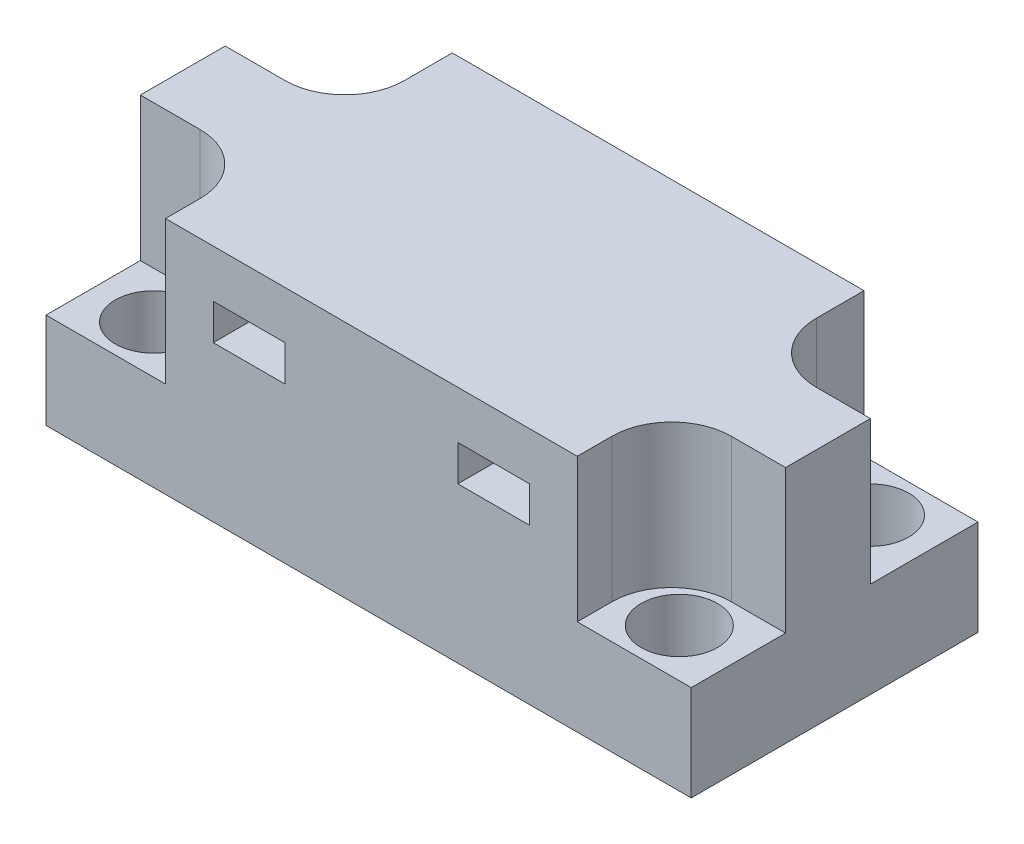
ISO-10303-21;
HEADER;
FILE_DESCRIPTION(('STEP AP214'),'2;1');
FILE_NAME('part.step','',(''),(''),'','','');
FILE_SCHEMA(('AUTOMOTIVE_DESIGN { 1 0 10303 214 1 1 1 1 }'));
ENDSEC;
DATA;
#1=APPLICATION_CONTEXT('core data for automotive mechanical design processes');
#2=APPLICATION_PROTOCOL_DEFINITION('international standard','automotive_design',2000,#1);
#3=PRODUCT_CONTEXT('',#1,'mechanical');
#4=PRODUCT('Part','Part','',(#3));
#5=PRODUCT_RELATED_PRODUCT_CATEGORY('part','',(#4));
#6=PRODUCT_DEFINITION_FORMATION('','',#4);
#7=PRODUCT_DEFINITION_CONTEXT('part definition',#1,'design');
#8=PRODUCT_DEFINITION('design','',#6,#7);
#9=PRODUCT_DEFINITION_SHAPE('','',#8);
#10=(LENGTH_UNIT() NAMED_UNIT(*) SI_UNIT(.MILLI.,.METRE.));
#11=(NAMED_UNIT(*) PLANE_ANGLE_UNIT() SI_UNIT($,.RADIAN.));
#12=(NAMED_UNIT(*) SI_UNIT($,.STERADIAN.) SOLID_ANGLE_UNIT());
#13=UNCERTAINTY_MEASURE_WITH_UNIT(LENGTH_MEASURE(1.E-05),#10,'distance_accuracy_value','');
#14=(GEOMETRIC_REPRESENTATION_CONTEXT(3) GLOBAL_UNCERTAINTY_ASSIGNED_CONTEXT((#13)) GLOBAL_UNIT_ASSIGNED_CONTEXT((#10,
#11,#12)) REPRESENTATION_CONTEXT('',''));
#15=CARTESIAN_POINT('',(0.,0.,0.));
#16=DIRECTION('',(0.,0.,1.));
#17=DIRECTION('',(1.,0.,0.));
#18=AXIS2_PLACEMENT_3D('',#15,#16,#17);
#19=CARTESIAN_POINT('',(11000.,10000.,4000.));
#20=DIRECTION('',(0.,-1.,0.));
#21=DIRECTION('',(0.,0.,-1.));
#22=AXIS2_PLACEMENT_3D('',#19,#20,#21);
#23=CYLINDRICAL_SURFACE('',#22,1600.);
#24=CARTESIAN_POINT('',(11000.,0.,4000.));
#25=DIRECTION('',(0.,1.,0.));
#26=DIRECTION('',(0.,0.,1.));
#27=AXIS2_PLACEMENT_3D('',#24,#25,#26);
#28=CIRCLE('',#27,1600.);
#29=CARTESIAN_POINT('',(11000.,0.,5600.));
#30=VERTEX_POINT('',#29);
#31=EDGE_CURVE('E395',#30,#30,#28,.T.);
#32=ORIENTED_EDGE('',*,*,#31,.F.);
#33=EDGE_LOOP('',(#32));
#34=FACE_BOUND('',#33,.T.);
#35=CARTESIAN_POINT('',(11000.,4000.,4000.));
#36=DIRECTION('',(0.,1.,0.));
#37=DIRECTION('',(0.,0.,1.));
#38=AXIS2_PLACEMENT_3D('',#35,#36,#37);
#39=CIRCLE('',#38,1600.);
#40=CARTESIAN_POINT('',(11000.,4000.,5600.));
#41=VERTEX_POINT('',#40);
#42=EDGE_CURVE('E307',#41,#41,#39,.T.);
#43=ORIENTED_EDGE('',*,*,#42,.T.);
#44=EDGE_LOOP('',(#43));
#45=FACE_BOUND('',#44,.T.);
#46=ADVANCED_FACE('F33',(#34,#45),#23,.F.);
#47=CARTESIAN_POINT('',(-11000.,10000.,-4000.));
#48=DIRECTION('',(0.,-1.,0.));
#49=DIRECTION('',(0.,0.,-1.));
#50=AXIS2_PLACEMENT_3D('',#47,#48,#49);
#51=CYLINDRICAL_SURFACE('',#50,1600.);
#52=CARTESIAN_POINT('',(-11000.,0.,-4000.));
#53=DIRECTION('',(0.,1.,0.));
#54=DIRECTION('',(0.,0.,1.));
#55=AXIS2_PLACEMENT_3D('',#52,#53,#54);
#56=CIRCLE('',#55,1600.);
#57=CARTESIAN_POINT('',(-11000.,0.,-2400.));
#58=VERTEX_POINT('',#57);
#59=EDGE_CURVE('E404',#58,#58,#56,.T.);
#60=ORIENTED_EDGE('',*,*,#59,.F.);
#61=EDGE_LOOP('',(#60));
#62=FACE_BOUND('',#61,.T.);
#63=CARTESIAN_POINT('',(-11000.,4000.,-4000.));
#64=DIRECTION('',(0.,1.,0.));
#65=DIRECTION('',(0.,0.,1.));
#66=AXIS2_PLACEMENT_3D('',#63,#64,#65);
#67=CIRCLE('',#66,1600.);
#68=CARTESIAN_POINT('',(-11000.,4000.,-2400.));
#69=VERTEX_POINT('',#68);
#70=EDGE_CURVE('E389',#69,#69,#67,.T.);
#71=ORIENTED_EDGE('',*,*,#70,.T.);
#72=EDGE_LOOP('',(#71));
#73=FACE_BOUND('',#72,.T.);
#74=ADVANCED_FACE('F555',(#62,#73),#51,.F.);
#75=CARTESIAN_POINT('',(0.,10000.,0.));
#76=DIRECTION('',(0.,1.,0.));
#77=DIRECTION('',(0.,0.,1.));
#78=AXIS2_PLACEMENT_3D('',#75,#76,#77);
#79=PLANE('',#78);
#80=DIRECTION('',(0.,0.,1.));
#81=VECTOR('',#80,1.);
#82=CARTESIAN_POINT('',(8731.79495048608,10000.,-4000.));
#83=LINE('',#82,#81);
#84=CARTESIAN_POINT('',(8731.79495048608,10000.,-6000.));
#85=VERTEX_POINT('',#84);
#86=CARTESIAN_POINT('',(8731.79495048608,10000.,-4000.));
#87=VERTEX_POINT('',#86);
#88=EDGE_CURVE('E291',#85,#87,#83,.T.);
#89=ORIENTED_EDGE('',*,*,#88,.F.);
#90=DIRECTION('',(-1.,0.,0.));
#91=VECTOR('',#90,1.);
#92=CARTESIAN_POINT('',(-13500.,10000.,-6000.));
#93=LINE('',#92,#91);
#94=CARTESIAN_POINT('',(-8500.,10000.,-6000.));
#95=VERTEX_POINT('',#94);
#96=EDGE_CURVE('E411',#85,#95,#93,.T.);
#97=ORIENTED_EDGE('',*,*,#96,.T.);
#98=DIRECTION('',(0.,0.,-1.));
#99=VECTOR('',#98,1.);
#100=CARTESIAN_POINT('',(-8500.,10000.,-4000.));
#101=LINE('',#100,#99);
#102=CARTESIAN_POINT('',(-8500.,10000.,-4000.));
#103=VERTEX_POINT('',#102);
#104=EDGE_CURVE('E370',#103,#95,#101,.T.);
#105=ORIENTED_EDGE('',*,*,#104,.F.);
#106=CARTESIAN_POINT('',(-11000.,10000.,-4000.));
#107=DIRECTION('',(0.,1.,0.));
#108=DIRECTION('',(0.,0.,1.));
#109=AXIS2_PLACEMENT_3D('',#106,#107,#108);
#110=CIRCLE('',#109,2500.);
#111=CARTESIAN_POINT('',(-11000.,10000.,-1500.));
#112=VERTEX_POINT('',#111);
#113=EDGE_CURVE('E382',#112,#103,#110,.T.);
#114=ORIENTED_EDGE('',*,*,#113,.F.);
#115=DIRECTION('',(1.,0.,0.));
#116=VECTOR('',#115,1.);
#117=CARTESIAN_POINT('',(-13500.,10000.,-1500.));
#118=LINE('',#117,#116);
#119=CARTESIAN_POINT('',(-13500.,10000.,-1500.));
#120=VERTEX_POINT('',#119);
#121=EDGE_CURVE('E366',#120,#112,#118,.T.);
#122=ORIENTED_EDGE('',*,*,#121,.F.);
#123=DIRECTION('',(0.,0.,1.));
#124=VECTOR('',#123,1.);
#125=CARTESIAN_POINT('',(-13500.,10000.,-6000.));
#126=LINE('',#125,#124);
#127=CARTESIAN_POINT('',(-13500.,10000.,2052.11755112264));
#128=VERTEX_POINT('',#127);
#129=EDGE_CURVE('E414',#120,#128,#126,.T.);
#130=ORIENTED_EDGE('',*,*,#129,.T.);
#131=DIRECTION('',(-1.,0.,0.));
#132=VECTOR('',#131,1.);
#133=CARTESIAN_POINT('',(-13500.,10000.,2052.11755112264));
#134=LINE('',#133,#132);
#135=CARTESIAN_POINT('',(-11000.,10000.,2052.11755112264));
#136=VERTEX_POINT('',#135);
#137=EDGE_CURVE('E342',#136,#128,#134,.T.);
#138=ORIENTED_EDGE('',*,*,#137,.F.);
#139=CARTESIAN_POINT('',(-11000.,10000.,4552.11755112264));
#140=DIRECTION('',(0.,1.,0.));
#141=DIRECTION('',(0.,0.,-1.));
#142=AXIS2_PLACEMENT_3D('',#139,#140,#141);
#143=CIRCLE('',#142,2500.);
#144=CARTESIAN_POINT('',(-8500.,10000.,4552.11755112264));
#145=VERTEX_POINT('',#144);
#146=EDGE_CURVE('E280',#145,#136,#143,.T.);
#147=ORIENTED_EDGE('',*,*,#146,.F.);
#148=DIRECTION('',(0.,0.,-1.));
#149=VECTOR('',#148,1.);
#150=CARTESIAN_POINT('',(-8500.,10000.,4552.11755112264));
#151=LINE('',#150,#149);
#152=CARTESIAN_POINT('',(-8500.,10000.,6000.));
#153=VERTEX_POINT('',#152);
#154=EDGE_CURVE('E332',#153,#145,#151,.T.);
#155=ORIENTED_EDGE('',*,*,#154,.F.);
#156=DIRECTION('',(1.,0.,0.));
#157=VECTOR('',#156,1.);
#158=CARTESIAN_POINT('',(-13500.,10000.,6000.));
#159=LINE('',#158,#157);
#160=CARTESIAN_POINT('',(8731.79495048608,10000.,6000.));
#161=VERTEX_POINT('',#160);
#162=EDGE_CURVE('E417',#153,#161,#159,.T.);
#163=ORIENTED_EDGE('',*,*,#162,.T.);
#164=DIRECTION('',(0.,0.,1.));
#165=VECTOR('',#164,1.);
#166=CARTESIAN_POINT('',(8731.79495048608,10000.,4552.11755112264));
#167=LINE('',#166,#165);
#168=CARTESIAN_POINT('',(8731.79495048608,10000.,4552.11755112264));
#169=VERTEX_POINT('',#168);
#170=EDGE_CURVE('E321',#169,#161,#167,.T.);
#171=ORIENTED_EDGE('',*,*,#170,.F.);
#172=CARTESIAN_POINT('',(11231.7949504861,10000.,4552.11755112264));
#173=DIRECTION('',(0.,1.,0.));
#174=DIRECTION('',(0.,0.,1.));
#175=AXIS2_PLACEMENT_3D('',#172,#173,#174);
#176=CIRCLE('',#175,2500.);
#177=CARTESIAN_POINT('',(11231.7949504861,10000.,2052.11755112264));
#178=VERTEX_POINT('',#177);
#179=EDGE_CURVE('E318',#178,#169,#176,.T.);
#180=ORIENTED_EDGE('',*,*,#179,.F.);
#181=DIRECTION('',(-1.,0.,0.));
#182=VECTOR('',#181,1.);
#183=CARTESIAN_POINT('',(13731.7949504861,10000.,2052.11755112264));
#184=LINE('',#183,#182);
#185=CARTESIAN_POINT('',(13500.,10000.,2052.11755112264));
#186=VERTEX_POINT('',#185);
#187=EDGE_CURVE('E313',#186,#178,#184,.T.);
#188=ORIENTED_EDGE('',*,*,#187,.F.);
#189=DIRECTION('',(0.,0.,-1.));
#190=VECTOR('',#189,1.);
#191=CARTESIAN_POINT('',(13500.,10000.,-6000.));
#192=LINE('',#191,#190);
#193=CARTESIAN_POINT('',(13500.,10000.,-1500.));
#194=VERTEX_POINT('',#193);
#195=EDGE_CURVE('E408',#186,#194,#192,.T.);
#196=ORIENTED_EDGE('',*,*,#195,.T.);
#197=DIRECTION('',(1.,0.,0.));
#198=VECTOR('',#197,1.);
#199=CARTESIAN_POINT('',(13731.7949504861,10000.,-1500.));
#200=LINE('',#199,#198);
#201=CARTESIAN_POINT('',(11231.7949504861,10000.,-1500.));
#202=VERTEX_POINT('',#201);
#203=EDGE_CURVE('E300',#202,#194,#200,.T.);
#204=ORIENTED_EDGE('',*,*,#203,.F.);
#205=CARTESIAN_POINT('',(11231.7949504861,10000.,-4000.));
#206=DIRECTION('',(0.,1.,0.));
#207=DIRECTION('',(0.,0.,-1.));
#208=AXIS2_PLACEMENT_3D('',#205,#206,#207);
#209=CIRCLE('',#208,2500.);
#210=EDGE_CURVE('E297',#87,#202,#209,.T.);
#211=ORIENTED_EDGE('',*,*,#210,.F.);
#212=EDGE_LOOP('',(#89,#97,#105,#114,#122,#130,#138,#147,#155,#163,#171,#180,#188,#196,#204,#211));
#213=FACE_BOUND('',#212,.T.);
#214=ADVANCED_FACE('F470',(#213),#79,.T.);
#215=CARTESIAN_POINT('',(0.,0.,0.));
#216=DIRECTION('',(0.,1.,0.));
#217=DIRECTION('',(0.,0.,1.));
#218=AXIS2_PLACEMENT_3D('',#215,#216,#217);
#219=PLANE('',#218);
#220=DIRECTION('',(0.,0.,-1.));
#221=VECTOR('',#220,1.);
#222=CARTESIAN_POINT('',(13500.,0.,-6000.));
#223=LINE('',#222,#221);
#224=CARTESIAN_POINT('',(13500.,0.,6000.));
#225=VERTEX_POINT('',#224);
#226=CARTESIAN_POINT('',(13500.,0.,-6000.));
#227=VERTEX_POINT('',#226);
#228=EDGE_CURVE('E407',#225,#227,#223,.T.);
#229=ORIENTED_EDGE('',*,*,#228,.F.);
#230=DIRECTION('',(1.,0.,0.));
#231=VECTOR('',#230,1.);
#232=CARTESIAN_POINT('',(-13500.,0.,6000.));
#233=LINE('',#232,#231);
#234=CARTESIAN_POINT('',(-13500.,0.,6000.));
#235=VERTEX_POINT('',#234);
#236=EDGE_CURVE('E412',#235,#225,#233,.T.);
#237=ORIENTED_EDGE('',*,*,#236,.F.);
#238=DIRECTION('',(0.,0.,1.));
#239=VECTOR('',#238,1.);
#240=CARTESIAN_POINT('',(-13500.,0.,-6000.));
#241=LINE('',#240,#239);
#242=CARTESIAN_POINT('',(-13500.,0.,-6000.));
#243=VERTEX_POINT('',#242);
#244=EDGE_CURVE('E426',#243,#235,#241,.T.);
#245=ORIENTED_EDGE('',*,*,#244,.F.);
#246=DIRECTION('',(-1.,0.,0.));
#247=VECTOR('',#246,1.);
#248=CARTESIAN_POINT('',(-13500.,0.,-6000.));
#249=LINE('',#248,#247);
#250=EDGE_CURVE('E423',#227,#243,#249,.T.);
#251=ORIENTED_EDGE('',*,*,#250,.F.);
#252=EDGE_LOOP('',(#229,#237,#245,#251));
#253=FACE_BOUND('',#252,.T.);
#254=ORIENTED_EDGE('',*,*,#59,.T.);
#255=EDGE_LOOP('',(#254));
#256=FACE_BOUND('',#255,.T.);
#257=CARTESIAN_POINT('',(11000.,0.,-4000.));
#258=DIRECTION('',(0.,1.,0.));
#259=DIRECTION('',(0.,0.,1.));
#260=AXIS2_PLACEMENT_3D('',#257,#258,#259);
#261=CIRCLE('',#260,1600.);
#262=CARTESIAN_POINT('',(11000.,0.,-2400.));
#263=VERTEX_POINT('',#262);
#264=EDGE_CURVE('E401',#263,#263,#261,.T.);
#265=ORIENTED_EDGE('',*,*,#264,.T.);
#266=EDGE_LOOP('',(#265));
#267=FACE_BOUND('',#266,.T.);
#268=CARTESIAN_POINT('',(-11000.,0.,4000.));
#269=DIRECTION('',(0.,1.,0.));
#270=DIRECTION('',(0.,0.,1.));
#271=AXIS2_PLACEMENT_3D('',#268,#269,#270);
#272=CIRCLE('',#271,1600.);
#273=CARTESIAN_POINT('',(-11000.,0.,5600.));
#274=VERTEX_POINT('',#273);
#275=EDGE_CURVE('E398',#274,#274,#272,.T.);
#276=ORIENTED_EDGE('',*,*,#275,.T.);
#277=EDGE_LOOP('',(#276));
#278=FACE_BOUND('',#277,.T.);
#279=ORIENTED_EDGE('',*,*,#31,.T.);
#280=EDGE_LOOP('',(#279));
#281=FACE_BOUND('',#280,.T.);
#282=ADVANCED_FACE('F489',(#253,#256,#267,#278,#281),#219,.F.);
#283=CARTESIAN_POINT('',(13500.,10000.,-6000.));
#284=DIRECTION('',(-1.,0.,0.));
#285=DIRECTION('',(0.,0.,1.));
#286=AXIS2_PLACEMENT_3D('',#283,#284,#285);
#287=PLANE('',#286);
#288=DIRECTION('',(0.,0.,1.));
#289=VECTOR('',#288,1.);
#290=CARTESIAN_POINT('',(13500.,4000.,-6000.));
#291=LINE('',#290,#289);
#292=CARTESIAN_POINT('',(13500.,4000.,-6000.));
#293=VERTEX_POINT('',#292);
#294=CARTESIAN_POINT('',(13500.,4000.,-1500.));
#295=VERTEX_POINT('',#294);
#296=EDGE_CURVE('E363',#293,#295,#291,.T.);
#297=ORIENTED_EDGE('',*,*,#296,.T.);
#298=DIRECTION('',(0.,1.,0.));
#299=VECTOR('',#298,1.);
#300=CARTESIAN_POINT('',(13500.,10000.,-1500.));
#301=LINE('',#300,#299);
#302=EDGE_CURVE('E11',#295,#194,#301,.T.);
#303=ORIENTED_EDGE('',*,*,#302,.T.);
#304=ORIENTED_EDGE('',*,*,#195,.F.);
#305=DIRECTION('',(0.,-1.,0.));
#306=VECTOR('',#305,1.);
#307=CARTESIAN_POINT('',(13500.,10000.,2052.11755112264));
#308=LINE('',#307,#306);
#309=CARTESIAN_POINT('',(13500.,4000.,2052.11755112264));
#310=VERTEX_POINT('',#309);
#311=EDGE_CURVE('E41',#186,#310,#308,.T.);
#312=ORIENTED_EDGE('',*,*,#311,.T.);
#313=DIRECTION('',(0.,0.,-1.));
#314=VECTOR('',#313,1.);
#315=CARTESIAN_POINT('',(13500.,4000.,-6000.));
#316=LINE('',#315,#314);
#317=CARTESIAN_POINT('',(13500.,4000.,6000.));
#318=VERTEX_POINT('',#317);
#319=EDGE_CURVE('E353',#318,#310,#316,.T.);
#320=ORIENTED_EDGE('',*,*,#319,.F.);
#321=DIRECTION('',(0.,-1.,0.));
#322=VECTOR('',#321,1.);
#323=CARTESIAN_POINT('',(13500.,10000.,6000.));
#324=LINE('',#323,#322);
#325=EDGE_CURVE('E420',#318,#225,#324,.T.);
#326=ORIENTED_EDGE('',*,*,#325,.T.);
#327=ORIENTED_EDGE('',*,*,#228,.T.);
#328=DIRECTION('',(0.,-1.,0.));
#329=VECTOR('',#328,1.);
#330=CARTESIAN_POINT('',(13500.,10000.,-6000.));
#331=LINE('',#330,#329);
#332=EDGE_CURVE('E436',#293,#227,#331,.T.);
#333=ORIENTED_EDGE('',*,*,#332,.F.);
#334=EDGE_LOOP('',(#297,#303,#304,#312,#320,#326,#327,#333));
#335=FACE_BOUND('',#334,.T.);
#336=ADVANCED_FACE('F35',(#335),#287,.F.);
#337=CARTESIAN_POINT('',(-13500.,10000.,-6000.));
#338=DIRECTION('',(0.,0.,1.));
#339=DIRECTION('',(1.,0.,0.));
#340=AXIS2_PLACEMENT_3D('',#337,#338,#339);
#341=PLANE('',#340);
#342=DIRECTION('',(0.,1.,0.));
#343=VECTOR('',#342,1.);
#344=CARTESIAN_POINT('',(6731.79495048608,8000.,-6000.));
#345=LINE('',#344,#343);
#346=CARTESIAN_POINT('',(6731.79495048608,6500.,-6000.));
#347=VERTEX_POINT('',#346);
#348=CARTESIAN_POINT('',(6731.79495048608,8000.,-6000.));
#349=VERTEX_POINT('',#348);
#350=EDGE_CURVE('E226',#347,#349,#345,.T.);
#351=ORIENTED_EDGE('',*,*,#350,.T.);
#352=DIRECTION('',(-1.,0.,0.));
#353=VECTOR('',#352,1.);
#354=CARTESIAN_POINT('',(6731.79495048608,8000.,-6000.));
#355=LINE('',#354,#353);
#356=CARTESIAN_POINT('',(3731.79495048608,8000.,-6000.));
#357=VERTEX_POINT('',#356);
#358=EDGE_CURVE('E220',#349,#357,#355,.T.);
#359=ORIENTED_EDGE('',*,*,#358,.T.);
#360=DIRECTION('',(0.,-1.,0.));
#361=VECTOR('',#360,1.);
#362=CARTESIAN_POINT('',(3731.79495048608,8000.,-6000.));
#363=LINE('',#362,#361);
#364=CARTESIAN_POINT('',(3731.79495048608,6500.,-6000.));
#365=VERTEX_POINT('',#364);
#366=EDGE_CURVE('E229',#357,#365,#363,.T.);
#367=ORIENTED_EDGE('',*,*,#366,.T.);
#368=DIRECTION('',(1.,0.,0.));
#369=VECTOR('',#368,1.);
#370=CARTESIAN_POINT('',(6731.79495048608,6500.,-6000.));
#371=LINE('',#370,#369);
#372=EDGE_CURVE('E48',#365,#347,#371,.T.);
#373=ORIENTED_EDGE('',*,*,#372,.T.);
#374=EDGE_LOOP('',(#351,#359,#367,#373));
#375=FACE_BOUND('',#374,.T.);
#376=DIRECTION('',(-1.,0.,0.));
#377=VECTOR('',#376,1.);
#378=CARTESIAN_POINT('',(-6500.,8000.,-6000.));
#379=LINE('',#378,#377);
#380=CARTESIAN_POINT('',(-3500.,8000.,-6000.));
#381=VERTEX_POINT('',#380);
#382=CARTESIAN_POINT('',(-6500.,8000.,-6000.));
#383=VERTEX_POINT('',#382);
#384=EDGE_CURVE('E265',#381,#383,#379,.T.);
#385=ORIENTED_EDGE('',*,*,#384,.T.);
#386=DIRECTION('',(0.,-1.,0.));
#387=VECTOR('',#386,1.);
#388=CARTESIAN_POINT('',(-6500.,8000.,-6000.));
#389=LINE('',#388,#387);
#390=CARTESIAN_POINT('',(-6500.,6500.,-6000.));
#391=VERTEX_POINT('',#390);
#392=EDGE_CURVE('E255',#383,#391,#389,.T.);
#393=ORIENTED_EDGE('',*,*,#392,.T.);
#394=DIRECTION('',(1.,0.,0.));
#395=VECTOR('',#394,1.);
#396=CARTESIAN_POINT('',(-6500.,6500.,-6000.));
#397=LINE('',#396,#395);
#398=CARTESIAN_POINT('',(-3500.,6500.,-6000.));
#399=VERTEX_POINT('',#398);
#400=EDGE_CURVE('E258',#391,#399,#397,.T.);
#401=ORIENTED_EDGE('',*,*,#400,.T.);
#402=DIRECTION('',(0.,1.,0.));
#403=VECTOR('',#402,1.);
#404=CARTESIAN_POINT('',(-3500.,8000.,-6000.));
#405=LINE('',#404,#403);
#406=EDGE_CURVE('E262',#399,#381,#405,.T.);
#407=ORIENTED_EDGE('',*,*,#406,.T.);
#408=EDGE_LOOP('',(#385,#393,#401,#407));
#409=FACE_BOUND('',#408,.T.);
#410=ORIENTED_EDGE('',*,*,#96,.F.);
#411=DIRECTION('',(0.,-1.,0.));
#412=VECTOR('',#411,1.);
#413=CARTESIAN_POINT('',(8731.79495048608,10000.,-6000.));
#414=LINE('',#413,#412);
#415=CARTESIAN_POINT('',(8731.79495048608,4000.,-6000.));
#416=VERTEX_POINT('',#415);
#417=EDGE_CURVE('E455',#85,#416,#414,.T.);
#418=ORIENTED_EDGE('',*,*,#417,.T.);
#419=DIRECTION('',(1.,0.,0.));
#420=VECTOR('',#419,1.);
#421=CARTESIAN_POINT('',(-13500.,4000.,-6000.));
#422=LINE('',#421,#420);
#423=EDGE_CURVE('E360',#416,#293,#422,.T.);
#424=ORIENTED_EDGE('',*,*,#423,.T.);
#425=ORIENTED_EDGE('',*,*,#332,.T.);
#426=ORIENTED_EDGE('',*,*,#250,.T.);
#427=DIRECTION('',(0.,-1.,0.));
#428=VECTOR('',#427,1.);
#429=CARTESIAN_POINT('',(-13500.,10000.,-6000.));
#430=LINE('',#429,#428);
#431=CARTESIAN_POINT('',(-13500.,4000.,-6000.));
#432=VERTEX_POINT('',#431);
#433=EDGE_CURVE('E434',#432,#243,#430,.T.);
#434=ORIENTED_EDGE('',*,*,#433,.F.);
#435=DIRECTION('',(-1.,0.,0.));
#436=VECTOR('',#435,1.);
#437=CARTESIAN_POINT('',(-13500.,4000.,-6000.));
#438=LINE('',#437,#436);
#439=CARTESIAN_POINT('',(-8500.,4000.,-6000.));
#440=VERTEX_POINT('',#439);
#441=EDGE_CURVE('E393',#440,#432,#438,.T.);
#442=ORIENTED_EDGE('',*,*,#441,.F.);
#443=DIRECTION('',(0.,1.,0.));
#444=VECTOR('',#443,1.);
#445=CARTESIAN_POINT('',(-8500.,10000.,-6000.));
#446=LINE('',#445,#444);
#447=EDGE_CURVE('E438',#440,#95,#446,.T.);
#448=ORIENTED_EDGE('',*,*,#447,.T.);
#449=EDGE_LOOP('',(#410,#418,#424,#425,#426,#434,#442,#448));
#450=FACE_BOUND('',#449,.T.);
#451=ADVANCED_FACE('F233',(#375,#409,#450),#341,.F.);
#452=CARTESIAN_POINT('',(-13500.,10000.,-6000.));
#453=DIRECTION('',(1.,0.,0.));
#454=DIRECTION('',(0.,0.,-1.));
#455=AXIS2_PLACEMENT_3D('',#452,#453,#454);
#456=PLANE('',#455);
#457=DIRECTION('',(0.,0.,1.));
#458=VECTOR('',#457,1.);
#459=CARTESIAN_POINT('',(-13500.,4000.,4552.11755112264));
#460=LINE('',#459,#458);
#461=CARTESIAN_POINT('',(-13500.,4000.,2052.11755112264));
#462=VERTEX_POINT('',#461);
#463=CARTESIAN_POINT('',(-13500.,4000.,6000.));
#464=VERTEX_POINT('',#463);
#465=EDGE_CURVE('E335',#462,#464,#460,.T.);
#466=ORIENTED_EDGE('',*,*,#465,.F.);
#467=DIRECTION('',(0.,1.,0.));
#468=VECTOR('',#467,1.);
#469=CARTESIAN_POINT('',(-13500.,4000.,2052.11755112264));
#470=LINE('',#469,#468);
#471=EDGE_CURVE('E347',#462,#128,#470,.T.);
#472=ORIENTED_EDGE('',*,*,#471,.T.);
#473=ORIENTED_EDGE('',*,*,#129,.F.);
#474=DIRECTION('',(0.,1.,0.));
#475=VECTOR('',#474,1.);
#476=CARTESIAN_POINT('',(-13500.,4000.,-1500.));
#477=LINE('',#476,#475);
#478=CARTESIAN_POINT('',(-13500.,4000.,-1500.));
#479=VERTEX_POINT('',#478);
#480=EDGE_CURVE('E379',#479,#120,#477,.T.);
#481=ORIENTED_EDGE('',*,*,#480,.F.);
#482=DIRECTION('',(0.,0.,1.));
#483=VECTOR('',#482,1.);
#484=CARTESIAN_POINT('',(-13500.,4000.,-6500.));
#485=LINE('',#484,#483);
#486=EDGE_CURVE('E367',#432,#479,#485,.T.);
#487=ORIENTED_EDGE('',*,*,#486,.F.);
#488=ORIENTED_EDGE('',*,*,#433,.T.);
#489=ORIENTED_EDGE('',*,*,#244,.T.);
#490=DIRECTION('',(0.,-1.,0.));
#491=VECTOR('',#490,1.);
#492=CARTESIAN_POINT('',(-13500.,10000.,6000.));
#493=LINE('',#492,#491);
#494=EDGE_CURVE('E432',#464,#235,#493,.T.);
#495=ORIENTED_EDGE('',*,*,#494,.F.);
#496=EDGE_LOOP('',(#466,#472,#473,#481,#487,#488,#489,#495));
#497=FACE_BOUND('',#496,.T.);
#498=ADVANCED_FACE('F528',(#497),#456,.F.);
#499=CARTESIAN_POINT('',(-13500.,10000.,6000.));
#500=DIRECTION('',(0.,0.,-1.));
#501=DIRECTION('',(-1.,0.,0.));
#502=AXIS2_PLACEMENT_3D('',#499,#500,#501);
#503=PLANE('',#502);
#504=DIRECTION('',(0.,-1.,0.));
#505=VECTOR('',#504,1.);
#506=CARTESIAN_POINT('',(3731.79495048608,8000.,6000.));
#507=LINE('',#506,#505);
#508=CARTESIAN_POINT('',(3731.79495048608,8000.,6000.));
#509=VERTEX_POINT('',#508);
#510=CARTESIAN_POINT('',(3731.79495048608,6500.,6000.));
#511=VERTEX_POINT('',#510);
#512=EDGE_CURVE('E245',#509,#511,#507,.T.);
#513=ORIENTED_EDGE('',*,*,#512,.F.);
#514=DIRECTION('',(-1.,0.,0.));
#515=VECTOR('',#514,1.);
#516=CARTESIAN_POINT('',(6731.79495048608,8000.,6000.));
#517=LINE('',#516,#515);
#518=CARTESIAN_POINT('',(6731.79495048608,8000.,6000.));
#519=VERTEX_POINT('',#518);
#520=EDGE_CURVE('E56',#519,#509,#517,.T.);
#521=ORIENTED_EDGE('',*,*,#520,.F.);
#522=DIRECTION('',(0.,1.,0.));
#523=VECTOR('',#522,1.);
#524=CARTESIAN_POINT('',(6731.79495048608,8000.,6000.));
#525=LINE('',#524,#523);
#526=CARTESIAN_POINT('',(6731.79495048608,6500.,6000.));
#527=VERTEX_POINT('',#526);
#528=EDGE_CURVE('E236',#527,#519,#525,.T.);
#529=ORIENTED_EDGE('',*,*,#528,.F.);
#530=DIRECTION('',(1.,0.,0.));
#531=VECTOR('',#530,1.);
#532=CARTESIAN_POINT('',(6731.79495048608,6500.,6000.));
#533=LINE('',#532,#531);
#534=EDGE_CURVE('E239',#511,#527,#533,.T.);
#535=ORIENTED_EDGE('',*,*,#534,.F.);
#536=EDGE_LOOP('',(#513,#521,#529,#535));
#537=FACE_BOUND('',#536,.T.);
#538=DIRECTION('',(1.,0.,0.));
#539=VECTOR('',#538,1.);
#540=CARTESIAN_POINT('',(-6500.,6500.,6000.));
#541=LINE('',#540,#539);
#542=CARTESIAN_POINT('',(-6500.,6500.,6000.));
#543=VERTEX_POINT('',#542);
#544=CARTESIAN_POINT('',(-3500.,6500.,6000.));
#545=VERTEX_POINT('',#544);
#546=EDGE_CURVE('E270',#543,#545,#541,.T.);
#547=ORIENTED_EDGE('',*,*,#546,.F.);
#548=DIRECTION('',(0.,-1.,0.));
#549=VECTOR('',#548,1.);
#550=CARTESIAN_POINT('',(-6500.,8000.,6000.));
#551=LINE('',#550,#549);
#552=CARTESIAN_POINT('',(-6500.,8000.,6000.));
#553=VERTEX_POINT('',#552);
#554=EDGE_CURVE('E251',#553,#543,#551,.T.);
#555=ORIENTED_EDGE('',*,*,#554,.F.);
#556=DIRECTION('',(-1.,0.,0.));
#557=VECTOR('',#556,1.);
#558=CARTESIAN_POINT('',(-6500.,8000.,6000.));
#559=LINE('',#558,#557);
#560=CARTESIAN_POINT('',(-3500.,8000.,6000.));
#561=VERTEX_POINT('',#560);
#562=EDGE_CURVE('E259',#561,#553,#559,.T.);
#563=ORIENTED_EDGE('',*,*,#562,.F.);
#564=DIRECTION('',(0.,1.,0.));
#565=VECTOR('',#564,1.);
#566=CARTESIAN_POINT('',(-3500.,8000.,6000.));
#567=LINE('',#566,#565);
#568=EDGE_CURVE('E273',#545,#561,#567,.T.);
#569=ORIENTED_EDGE('',*,*,#568,.F.);
#570=EDGE_LOOP('',(#547,#555,#563,#569));
#571=FACE_BOUND('',#570,.T.);
#572=DIRECTION('',(1.,0.,0.));
#573=VECTOR('',#572,1.);
#574=CARTESIAN_POINT('',(-13500.,4000.,6000.));
#575=LINE('',#574,#573);
#576=CARTESIAN_POINT('',(8731.79495048608,4000.,6000.));
#577=VERTEX_POINT('',#576);
#578=EDGE_CURVE('E351',#577,#318,#575,.T.);
#579=ORIENTED_EDGE('',*,*,#578,.F.);
#580=DIRECTION('',(0.,1.,0.));
#581=VECTOR('',#580,1.);
#582=CARTESIAN_POINT('',(8731.79495048609,10000.,6000.));
#583=LINE('',#582,#581);
#584=EDGE_CURVE('E452',#577,#161,#583,.T.);
#585=ORIENTED_EDGE('',*,*,#584,.T.);
#586=ORIENTED_EDGE('',*,*,#162,.F.);
#587=DIRECTION('',(0.,-1.,0.));
#588=VECTOR('',#587,1.);
#589=CARTESIAN_POINT('',(-8500.,10000.,6000.));
#590=LINE('',#589,#588);
#591=CARTESIAN_POINT('',(-8500.,4000.,6000.));
#592=VERTEX_POINT('',#591);
#593=EDGE_CURVE('E443',#153,#592,#590,.T.);
#594=ORIENTED_EDGE('',*,*,#593,.T.);
#595=DIRECTION('',(-1.,0.,0.));
#596=VECTOR('',#595,1.);
#597=CARTESIAN_POINT('',(-13500.,4000.,6000.));
#598=LINE('',#597,#596);
#599=EDGE_CURVE('E356',#592,#464,#598,.T.);
#600=ORIENTED_EDGE('',*,*,#599,.T.);
#601=ORIENTED_EDGE('',*,*,#494,.T.);
#602=ORIENTED_EDGE('',*,*,#236,.T.);
#603=ORIENTED_EDGE('',*,*,#325,.F.);
#604=EDGE_LOOP('',(#579,#585,#586,#594,#600,#601,#602,#603));
#605=FACE_BOUND('',#604,.T.);
#606=ADVANCED_FACE('F482',(#537,#571,#605),#503,.F.);
#607=CARTESIAN_POINT('',(11000.,10000.,-4000.));
#608=DIRECTION('',(0.,-1.,0.));
#609=DIRECTION('',(0.,0.,-1.));
#610=AXIS2_PLACEMENT_3D('',#607,#608,#609);
#611=CYLINDRICAL_SURFACE('',#610,1600.);
#612=CARTESIAN_POINT('',(11000.,4000.,-4000.));
#613=DIRECTION('',(0.,-1.,0.));
#614=DIRECTION('',(0.,0.,-1.));
#615=AXIS2_PLACEMENT_3D('',#612,#613,#614);
#616=CIRCLE('',#615,1600.);
#617=CARTESIAN_POINT('',(11000.,4000.,-5600.));
#618=VERTEX_POINT('',#617);
#619=EDGE_CURVE('E359',#618,#618,#616,.T.);
#620=ORIENTED_EDGE('',*,*,#619,.F.);
#621=EDGE_LOOP('',(#620));
#622=FACE_BOUND('',#621,.T.);
#623=ORIENTED_EDGE('',*,*,#264,.F.);
#624=EDGE_LOOP('',(#623));
#625=FACE_BOUND('',#624,.T.);
#626=ADVANCED_FACE('F572',(#622,#625),#611,.F.);
#627=CARTESIAN_POINT('',(-11000.,10000.,4000.));
#628=DIRECTION('',(0.,-1.,0.));
#629=DIRECTION('',(0.,0.,-1.));
#630=AXIS2_PLACEMENT_3D('',#627,#628,#629);
#631=CYLINDRICAL_SURFACE('',#630,1600.);
#632=CARTESIAN_POINT('',(-11000.,4000.,4000.));
#633=DIRECTION('',(0.,-1.,0.));
#634=DIRECTION('',(0.,0.,-1.));
#635=AXIS2_PLACEMENT_3D('',#632,#633,#634);
#636=CIRCLE('',#635,1600.);
#637=CARTESIAN_POINT('',(-11000.,4000.,2400.));
#638=VERTEX_POINT('',#637);
#639=EDGE_CURVE('E355',#638,#638,#636,.T.);
#640=ORIENTED_EDGE('',*,*,#639,.F.);
#641=EDGE_LOOP('',(#640));
#642=FACE_BOUND('',#641,.T.);
#643=ORIENTED_EDGE('',*,*,#275,.F.);
#644=EDGE_LOOP('',(#643));
#645=FACE_BOUND('',#644,.T.);
#646=ADVANCED_FACE('F569',(#642,#645),#631,.F.);
#647=CARTESIAN_POINT('',(-8500.,4000.,-4000.));
#648=DIRECTION('',(1.,0.,0.));
#649=DIRECTION('',(0.,0.,-1.));
#650=AXIS2_PLACEMENT_3D('',#647,#648,#649);
#651=PLANE('',#650);
#652=DIRECTION('',(0.,0.,-1.));
#653=VECTOR('',#652,1.);
#654=CARTESIAN_POINT('',(-8500.,4000.,-4000.));
#655=LINE('',#654,#653);
#656=CARTESIAN_POINT('',(-8500.,4000.,-4000.));
#657=VERTEX_POINT('',#656);
#658=EDGE_CURVE('E376',#657,#440,#655,.T.);
#659=ORIENTED_EDGE('',*,*,#658,.F.);
#660=DIRECTION('',(0.,1.,0.));
#661=VECTOR('',#660,1.);
#662=CARTESIAN_POINT('',(-8500.,4000.,-4000.));
#663=LINE('',#662,#661);
#664=EDGE_CURVE('E387',#657,#103,#663,.T.);
#665=ORIENTED_EDGE('',*,*,#664,.T.);
#666=ORIENTED_EDGE('',*,*,#104,.T.);
#667=ORIENTED_EDGE('',*,*,#447,.F.);
#668=EDGE_LOOP('',(#659,#665,#666,#667));
#669=FACE_BOUND('',#668,.T.);
#670=ADVANCED_FACE('F512',(#669),#651,.F.);
#671=CARTESIAN_POINT('',(-11000.,4000.,-4000.));
#672=DIRECTION('',(0.,1.,0.));
#673=DIRECTION('',(0.,0.,1.));
#674=AXIS2_PLACEMENT_3D('',#671,#672,#673);
#675=PLANE('',#674);
#676=ORIENTED_EDGE('',*,*,#70,.F.);
#677=EDGE_LOOP('',(#676));
#678=FACE_BOUND('',#677,.T.);
#679=ORIENTED_EDGE('',*,*,#441,.T.);
#680=ORIENTED_EDGE('',*,*,#486,.T.);
#681=DIRECTION('',(1.,0.,0.));
#682=VECTOR('',#681,1.);
#683=CARTESIAN_POINT('',(-13500.,4000.,-1500.));
#684=LINE('',#683,#682);
#685=CARTESIAN_POINT('',(-11000.,4000.,-1500.));
#686=VERTEX_POINT('',#685);
#687=EDGE_CURVE('E369',#479,#686,#684,.T.);
#688=ORIENTED_EDGE('',*,*,#687,.T.);
#689=CARTESIAN_POINT('',(-11000.,4000.,-4000.));
#690=DIRECTION('',(0.,1.,0.));
#691=DIRECTION('',(0.,0.,1.));
#692=AXIS2_PLACEMENT_3D('',#689,#690,#691);
#693=CIRCLE('',#692,2500.);
#694=EDGE_CURVE('E373',#686,#657,#693,.T.);
#695=ORIENTED_EDGE('',*,*,#694,.T.);
#696=ORIENTED_EDGE('',*,*,#658,.T.);
#697=EDGE_LOOP('',(#679,#680,#688,#695,#696));
#698=FACE_BOUND('',#697,.T.);
#699=ADVANCED_FACE('F514',(#678,#698),#675,.T.);
#700=CARTESIAN_POINT('',(-11000.,4000.,-4000.));
#701=DIRECTION('',(0.,1.,0.));
#702=DIRECTION('',(0.,0.,1.));
#703=AXIS2_PLACEMENT_3D('',#700,#701,#702);
#704=CYLINDRICAL_SURFACE('',#703,2500.);
#705=ORIENTED_EDGE('',*,*,#113,.T.);
#706=ORIENTED_EDGE('',*,*,#664,.F.);
#707=ORIENTED_EDGE('',*,*,#694,.F.);
#708=DIRECTION('',(0.,1.,0.));
#709=VECTOR('',#708,1.);
#710=CARTESIAN_POINT('',(-11000.,4000.,-1500.));
#711=LINE('',#710,#709);
#712=EDGE_CURVE('E390',#686,#112,#711,.T.);
#713=ORIENTED_EDGE('',*,*,#712,.T.);
#714=EDGE_LOOP('',(#705,#706,#707,#713));
#715=FACE_BOUND('',#714,.T.);
#716=ADVANCED_FACE('F519',(#715),#704,.F.);
#717=CARTESIAN_POINT('',(-13500.,4000.,-1500.));
#718=DIRECTION('',(0.,0.,1.));
#719=DIRECTION('',(1.,0.,0.));
#720=AXIS2_PLACEMENT_3D('',#717,#718,#719);
#721=PLANE('',#720);
#722=ORIENTED_EDGE('',*,*,#121,.T.);
#723=ORIENTED_EDGE('',*,*,#712,.F.);
#724=ORIENTED_EDGE('',*,*,#687,.F.);
#725=ORIENTED_EDGE('',*,*,#480,.T.);
#726=EDGE_LOOP('',(#722,#723,#724,#725));
#727=FACE_BOUND('',#726,.T.);
#728=ADVANCED_FACE('F567',(#727),#721,.F.);
#729=CARTESIAN_POINT('',(13731.7949504861,4000.,2052.11755112264));
#730=DIRECTION('',(0.,0.,-1.));
#731=DIRECTION('',(-1.,0.,0.));
#732=AXIS2_PLACEMENT_3D('',#729,#730,#731);
#733=PLANE('',#732);
#734=ORIENTED_EDGE('',*,*,#187,.T.);
#735=DIRECTION('',(0.,1.,0.));
#736=VECTOR('',#735,1.);
#737=CARTESIAN_POINT('',(11231.7949504861,4000.,2052.11755112264));
#738=LINE('',#737,#736);
#739=CARTESIAN_POINT('',(11231.7949504861,4000.,2052.11755112264));
#740=VERTEX_POINT('',#739);
#741=EDGE_CURVE('E301',#740,#178,#738,.T.);
#742=ORIENTED_EDGE('',*,*,#741,.F.);
#743=DIRECTION('',(-1.,0.,0.));
#744=VECTOR('',#743,1.);
#745=CARTESIAN_POINT('',(13731.7949504861,4000.,2052.11755112264));
#746=LINE('',#745,#744);
#747=EDGE_CURVE('E315',#310,#740,#746,.T.);
#748=ORIENTED_EDGE('',*,*,#747,.F.);
#749=ORIENTED_EDGE('',*,*,#311,.F.);
#750=EDGE_LOOP('',(#734,#742,#748,#749));
#751=FACE_BOUND('',#750,.T.);
#752=ADVANCED_FACE('F465',(#751),#733,.F.);
#753=CARTESIAN_POINT('',(8731.79495048608,4000.,4552.11755112264));
#754=DIRECTION('',(-1.,0.,0.));
#755=DIRECTION('',(0.,0.,1.));
#756=AXIS2_PLACEMENT_3D('',#753,#754,#755);
#757=PLANE('',#756);
#758=DIRECTION('',(0.,0.,1.));
#759=VECTOR('',#758,1.);
#760=CARTESIAN_POINT('',(8731.79495048608,4000.,4552.11755112264));
#761=LINE('',#760,#759);
#762=CARTESIAN_POINT('',(8731.79495048608,4000.,4552.11755112264));
#763=VERTEX_POINT('',#762);
#764=EDGE_CURVE('E312',#763,#577,#761,.T.);
#765=ORIENTED_EDGE('',*,*,#764,.F.);
#766=DIRECTION('',(0.,1.,0.));
#767=VECTOR('',#766,1.);
#768=CARTESIAN_POINT('',(8731.79495048608,4000.,4552.11755112264));
#769=LINE('',#768,#767);
#770=EDGE_CURVE('E317',#763,#169,#769,.T.);
#771=ORIENTED_EDGE('',*,*,#770,.T.);
#772=ORIENTED_EDGE('',*,*,#170,.T.);
#773=ORIENTED_EDGE('',*,*,#584,.F.);
#774=EDGE_LOOP('',(#765,#771,#772,#773));
#775=FACE_BOUND('',#774,.T.);
#776=ADVANCED_FACE('F647',(#775),#757,.F.);
#777=CARTESIAN_POINT('',(11231.7949504861,4000.,4552.11755112264));
#778=DIRECTION('',(0.,1.,0.));
#779=DIRECTION('',(0.,0.,1.));
#780=AXIS2_PLACEMENT_3D('',#777,#778,#779);
#781=PLANE('',#780);
#782=ORIENTED_EDGE('',*,*,#42,.F.);
#783=EDGE_LOOP('',(#782));
#784=FACE_BOUND('',#783,.T.);
#785=ORIENTED_EDGE('',*,*,#319,.T.);
#786=ORIENTED_EDGE('',*,*,#747,.T.);
#787=CARTESIAN_POINT('',(11231.7949504861,4000.,4552.11755112264));
#788=DIRECTION('',(0.,1.,0.));
#789=DIRECTION('',(0.,0.,1.));
#790=AXIS2_PLACEMENT_3D('',#787,#788,#789);
#791=CIRCLE('',#790,2500.);
#792=EDGE_CURVE('E309',#740,#763,#791,.T.);
#793=ORIENTED_EDGE('',*,*,#792,.T.);
#794=ORIENTED_EDGE('',*,*,#764,.T.);
#795=ORIENTED_EDGE('',*,*,#578,.T.);
#796=EDGE_LOOP('',(#785,#786,#793,#794,#795));
#797=FACE_BOUND('',#796,.T.);
#798=ADVANCED_FACE('F478',(#784,#797),#781,.T.);
#799=CARTESIAN_POINT('',(11231.7949504861,4000.,4552.11755112264));
#800=DIRECTION('',(0.,1.,0.));
#801=DIRECTION('',(0.,0.,1.));
#802=AXIS2_PLACEMENT_3D('',#799,#800,#801);
#803=CYLINDRICAL_SURFACE('',#802,2500.);
#804=ORIENTED_EDGE('',*,*,#179,.T.);
#805=ORIENTED_EDGE('',*,*,#770,.F.);
#806=ORIENTED_EDGE('',*,*,#792,.F.);
#807=ORIENTED_EDGE('',*,*,#741,.T.);
#808=EDGE_LOOP('',(#804,#805,#806,#807));
#809=FACE_BOUND('',#808,.T.);
#810=ADVANCED_FACE('F474',(#809),#803,.F.);
#811=CARTESIAN_POINT('',(-8500.,4000.,4552.11755112264));
#812=DIRECTION('',(1.,0.,0.));
#813=DIRECTION('',(0.,0.,-1.));
#814=AXIS2_PLACEMENT_3D('',#811,#812,#813);
#815=PLANE('',#814);
#816=ORIENTED_EDGE('',*,*,#154,.T.);
#817=DIRECTION('',(0.,1.,0.));
#818=VECTOR('',#817,1.);
#819=CARTESIAN_POINT('',(-8500.,4000.,4552.11755112264));
#820=LINE('',#819,#818);
#821=CARTESIAN_POINT('',(-8500.,4000.,4552.11755112264));
#822=VERTEX_POINT('',#821);
#823=EDGE_CURVE('E322',#822,#145,#820,.T.);
#824=ORIENTED_EDGE('',*,*,#823,.F.);
#825=DIRECTION('',(0.,0.,-1.));
#826=VECTOR('',#825,1.);
#827=CARTESIAN_POINT('',(-8500.,4000.,4552.11755112264));
#828=LINE('',#827,#826);
#829=EDGE_CURVE('E337',#592,#822,#828,.T.);
#830=ORIENTED_EDGE('',*,*,#829,.F.);
#831=ORIENTED_EDGE('',*,*,#593,.F.);
#832=EDGE_LOOP('',(#816,#824,#830,#831));
#833=FACE_BOUND('',#832,.T.);
#834=ADVANCED_FACE('F543',(#833),#815,.F.);
#835=CARTESIAN_POINT('',(-11000.,4000.,4552.11755112264));
#836=DIRECTION('',(0.,-1.,0.));
#837=DIRECTION('',(0.,0.,-1.));
#838=AXIS2_PLACEMENT_3D('',#835,#836,#837);
#839=PLANE('',#838);
#840=ORIENTED_EDGE('',*,*,#639,.T.);
#841=EDGE_LOOP('',(#840));
#842=FACE_BOUND('',#841,.T.);
#843=ORIENTED_EDGE('',*,*,#829,.T.);
#844=CARTESIAN_POINT('',(-11000.,4000.,4552.11755112264));
#845=DIRECTION('',(0.,1.,0.));
#846=DIRECTION('',(0.,0.,-1.));
#847=AXIS2_PLACEMENT_3D('',#844,#845,#846);
#848=CIRCLE('',#847,2500.);
#849=CARTESIAN_POINT('',(-11000.,4000.,2052.11755112264));
#850=VERTEX_POINT('',#849);
#851=EDGE_CURVE('E328',#822,#850,#848,.T.);
#852=ORIENTED_EDGE('',*,*,#851,.T.);
#853=DIRECTION('',(-1.,0.,0.));
#854=VECTOR('',#853,1.);
#855=CARTESIAN_POINT('',(-13500.,4000.,2052.11755112264));
#856=LINE('',#855,#854);
#857=EDGE_CURVE('E331',#850,#462,#856,.T.);
#858=ORIENTED_EDGE('',*,*,#857,.T.);
#859=ORIENTED_EDGE('',*,*,#465,.T.);
#860=ORIENTED_EDGE('',*,*,#599,.F.);
#861=EDGE_LOOP('',(#843,#852,#858,#859,#860));
#862=FACE_BOUND('',#861,.T.);
#863=ADVANCED_FACE('F534',(#842,#862),#839,.F.);
#864=CARTESIAN_POINT('',(-11000.,4000.,4552.11755112264));
#865=DIRECTION('',(0.,1.,0.));
#866=DIRECTION('',(0.,0.,1.));
#867=AXIS2_PLACEMENT_3D('',#864,#865,#866);
#868=CYLINDRICAL_SURFACE('',#867,2500.);
#869=ORIENTED_EDGE('',*,*,#146,.T.);
#870=DIRECTION('',(0.,1.,0.));
#871=VECTOR('',#870,1.);
#872=CARTESIAN_POINT('',(-11000.,4000.,2052.11755112264));
#873=LINE('',#872,#871);
#874=EDGE_CURVE('E339',#850,#136,#873,.T.);
#875=ORIENTED_EDGE('',*,*,#874,.F.);
#876=ORIENTED_EDGE('',*,*,#851,.F.);
#877=ORIENTED_EDGE('',*,*,#823,.T.);
#878=EDGE_LOOP('',(#869,#875,#876,#877));
#879=FACE_BOUND('',#878,.T.);
#880=ADVANCED_FACE('F539',(#879),#868,.F.);
#881=CARTESIAN_POINT('',(-13500.,4000.,2052.11755112264));
#882=DIRECTION('',(0.,0.,-1.));
#883=DIRECTION('',(-1.,0.,0.));
#884=AXIS2_PLACEMENT_3D('',#881,#882,#883);
#885=PLANE('',#884);
#886=ORIENTED_EDGE('',*,*,#137,.T.);
#887=ORIENTED_EDGE('',*,*,#471,.F.);
#888=ORIENTED_EDGE('',*,*,#857,.F.);
#889=ORIENTED_EDGE('',*,*,#874,.T.);
#890=EDGE_LOOP('',(#886,#887,#888,#889));
#891=FACE_BOUND('',#890,.T.);
#892=ADVANCED_FACE('F532',(#891),#885,.F.);
#893=CARTESIAN_POINT('',(13731.7949504861,4000.,-1500.));
#894=DIRECTION('',(0.,0.,1.));
#895=DIRECTION('',(1.,0.,0.));
#896=AXIS2_PLACEMENT_3D('',#893,#894,#895);
#897=PLANE('',#896);
#898=DIRECTION('',(1.,0.,0.));
#899=VECTOR('',#898,1.);
#900=CARTESIAN_POINT('',(13731.7949504861,4000.,-1500.));
#901=LINE('',#900,#899);
#902=CARTESIAN_POINT('',(11231.7949504861,4000.,-1500.));
#903=VERTEX_POINT('',#902);
#904=EDGE_CURVE('E290',#903,#295,#901,.T.);
#905=ORIENTED_EDGE('',*,*,#904,.F.);
#906=DIRECTION('',(0.,1.,0.));
#907=VECTOR('',#906,1.);
#908=CARTESIAN_POINT('',(11231.7949504861,4000.,-1500.));
#909=LINE('',#908,#907);
#910=EDGE_CURVE('E296',#903,#202,#909,.T.);
#911=ORIENTED_EDGE('',*,*,#910,.T.);
#912=ORIENTED_EDGE('',*,*,#203,.T.);
#913=ORIENTED_EDGE('',*,*,#302,.F.);
#914=EDGE_LOOP('',(#905,#911,#912,#913));
#915=FACE_BOUND('',#914,.T.);
#916=ADVANCED_FACE('F508',(#915),#897,.F.);
#917=CARTESIAN_POINT('',(8731.79495048608,4000.,-4000.));
#918=DIRECTION('',(-1.,0.,0.));
#919=DIRECTION('',(0.,0.,1.));
#920=AXIS2_PLACEMENT_3D('',#917,#918,#919);
#921=PLANE('',#920);
#922=ORIENTED_EDGE('',*,*,#88,.T.);
#923=DIRECTION('',(0.,1.,0.));
#924=VECTOR('',#923,1.);
#925=CARTESIAN_POINT('',(8731.79495048608,4000.,-4000.));
#926=LINE('',#925,#924);
#927=CARTESIAN_POINT('',(8731.79495048608,4000.,-4000.));
#928=VERTEX_POINT('',#927);
#929=EDGE_CURVE('E304',#928,#87,#926,.T.);
#930=ORIENTED_EDGE('',*,*,#929,.F.);
#931=DIRECTION('',(0.,0.,1.));
#932=VECTOR('',#931,1.);
#933=CARTESIAN_POINT('',(8731.79495048608,4000.,-4000.));
#934=LINE('',#933,#932);
#935=EDGE_CURVE('E294',#416,#928,#934,.T.);
#936=ORIENTED_EDGE('',*,*,#935,.F.);
#937=ORIENTED_EDGE('',*,*,#417,.F.);
#938=EDGE_LOOP('',(#922,#930,#936,#937));
#939=FACE_BOUND('',#938,.T.);
#940=ADVANCED_FACE('F501',(#939),#921,.F.);
#941=CARTESIAN_POINT('',(11231.7949504861,4000.,-4000.));
#942=DIRECTION('',(0.,-1.,0.));
#943=DIRECTION('',(0.,0.,-1.));
#944=AXIS2_PLACEMENT_3D('',#941,#942,#943);
#945=PLANE('',#944);
#946=ORIENTED_EDGE('',*,*,#619,.T.);
#947=EDGE_LOOP('',(#946));
#948=FACE_BOUND('',#947,.T.);
#949=ORIENTED_EDGE('',*,*,#423,.F.);
#950=ORIENTED_EDGE('',*,*,#935,.T.);
#951=CARTESIAN_POINT('',(11231.7949504861,4000.,-4000.));
#952=DIRECTION('',(0.,1.,0.));
#953=DIRECTION('',(0.,0.,-1.));
#954=AXIS2_PLACEMENT_3D('',#951,#952,#953);
#955=CIRCLE('',#954,2500.);
#956=EDGE_CURVE('E287',#928,#903,#955,.T.);
#957=ORIENTED_EDGE('',*,*,#956,.T.);
#958=ORIENTED_EDGE('',*,*,#904,.T.);
#959=ORIENTED_EDGE('',*,*,#296,.F.);
#960=EDGE_LOOP('',(#949,#950,#957,#958,#959));
#961=FACE_BOUND('',#960,.T.);
#962=ADVANCED_FACE('F498',(#948,#961),#945,.F.);
#963=CARTESIAN_POINT('',(11231.7949504861,4000.,-4000.));
#964=DIRECTION('',(0.,1.,0.));
#965=DIRECTION('',(0.,0.,1.));
#966=AXIS2_PLACEMENT_3D('',#963,#964,#965);
#967=CYLINDRICAL_SURFACE('',#966,2500.);
#968=ORIENTED_EDGE('',*,*,#210,.T.);
#969=ORIENTED_EDGE('',*,*,#910,.F.);
#970=ORIENTED_EDGE('',*,*,#956,.F.);
#971=ORIENTED_EDGE('',*,*,#929,.T.);
#972=EDGE_LOOP('',(#968,#969,#970,#971));
#973=FACE_BOUND('',#972,.T.);
#974=ADVANCED_FACE('F505',(#973),#967,.F.);
#975=CARTESIAN_POINT('',(-6500.,8000.,-6000.));
#976=DIRECTION('',(-1.,0.,0.));
#977=DIRECTION('',(0.,0.,1.));
#978=AXIS2_PLACEMENT_3D('',#975,#976,#977);
#979=PLANE('',#978);
#980=ORIENTED_EDGE('',*,*,#554,.T.);
#981=DIRECTION('',(0.,0.,1.));
#982=VECTOR('',#981,1.);
#983=CARTESIAN_POINT('',(-6500.,6500.,-6000.));
#984=LINE('',#983,#982);
#985=EDGE_CURVE('E268',#391,#543,#984,.T.);
#986=ORIENTED_EDGE('',*,*,#985,.F.);
#987=ORIENTED_EDGE('',*,*,#392,.F.);
#988=DIRECTION('',(0.,0.,1.));
#989=VECTOR('',#988,1.);
#990=CARTESIAN_POINT('',(-6500.,8000.,-6000.));
#991=LINE('',#990,#989);
#992=EDGE_CURVE('E278',#383,#553,#991,.T.);
#993=ORIENTED_EDGE('',*,*,#992,.T.);
#994=EDGE_LOOP('',(#980,#986,#987,#993));
#995=FACE_BOUND('',#994,.T.);
#996=ADVANCED_FACE('F726',(#995),#979,.F.);
#997=CARTESIAN_POINT('',(-6500.,8000.,-6000.));
#998=DIRECTION('',(0.,1.,0.));
#999=DIRECTION('',(0.,0.,1.));
#1000=AXIS2_PLACEMENT_3D('',#997,#998,#999);
#1001=PLANE('',#1000);
#1002=ORIENTED_EDGE('',*,*,#562,.T.);
#1003=ORIENTED_EDGE('',*,*,#992,.F.);
#1004=ORIENTED_EDGE('',*,*,#384,.F.);
#1005=DIRECTION('',(0.,0.,1.));
#1006=VECTOR('',#1005,1.);
#1007=CARTESIAN_POINT('',(-3500.,8000.,-6000.));
#1008=LINE('',#1007,#1006);
#1009=EDGE_CURVE('E281',#381,#561,#1008,.T.);
#1010=ORIENTED_EDGE('',*,*,#1009,.T.);
#1011=EDGE_LOOP('',(#1002,#1003,#1004,#1010));
#1012=FACE_BOUND('',#1011,.T.);
#1013=ADVANCED_FACE('F734',(#1012),#1001,.F.);
#1014=CARTESIAN_POINT('',(-3500.,8000.,-6000.));
#1015=DIRECTION('',(1.,0.,0.));
#1016=DIRECTION('',(0.,0.,-1.));
#1017=AXIS2_PLACEMENT_3D('',#1014,#1015,#1016);
#1018=PLANE('',#1017);
#1019=ORIENTED_EDGE('',*,*,#568,.T.);
#1020=ORIENTED_EDGE('',*,*,#1009,.F.);
#1021=ORIENTED_EDGE('',*,*,#406,.F.);
#1022=DIRECTION('',(0.,0.,1.));
#1023=VECTOR('',#1022,1.);
#1024=CARTESIAN_POINT('',(-3500.,6500.,-6000.));
#1025=LINE('',#1024,#1023);
#1026=EDGE_CURVE('E283',#399,#545,#1025,.T.);
#1027=ORIENTED_EDGE('',*,*,#1026,.T.);
#1028=EDGE_LOOP('',(#1019,#1020,#1021,#1027));
#1029=FACE_BOUND('',#1028,.T.);
#1030=ADVANCED_FACE('F744',(#1029),#1018,.F.);
#1031=CARTESIAN_POINT('',(-6500.,6500.,-6000.));
#1032=DIRECTION('',(0.,-1.,0.));
#1033=DIRECTION('',(0.,0.,-1.));
#1034=AXIS2_PLACEMENT_3D('',#1031,#1032,#1033);
#1035=PLANE('',#1034);
#1036=ORIENTED_EDGE('',*,*,#546,.T.);
#1037=ORIENTED_EDGE('',*,*,#1026,.F.);
#1038=ORIENTED_EDGE('',*,*,#400,.F.);
#1039=ORIENTED_EDGE('',*,*,#985,.T.);
#1040=EDGE_LOOP('',(#1036,#1037,#1038,#1039));
#1041=FACE_BOUND('',#1040,.T.);
#1042=ADVANCED_FACE('F753',(#1041),#1035,.F.);
#1043=CARTESIAN_POINT('',(6731.79495048608,8000.,-6000.));
#1044=DIRECTION('',(0.,1.,0.));
#1045=DIRECTION('',(0.,0.,1.));
#1046=AXIS2_PLACEMENT_3D('',#1043,#1044,#1045);
#1047=PLANE('',#1046);
#1048=ORIENTED_EDGE('',*,*,#520,.T.);
#1049=DIRECTION('',(0.,0.,1.));
#1050=VECTOR('',#1049,1.);
#1051=CARTESIAN_POINT('',(3731.79495048608,8000.,-6000.));
#1052=LINE('',#1051,#1050);
#1053=EDGE_CURVE('E216',#357,#509,#1052,.T.);
#1054=ORIENTED_EDGE('',*,*,#1053,.F.);
#1055=ORIENTED_EDGE('',*,*,#358,.F.);
#1056=DIRECTION('',(0.,0.,1.));
#1057=VECTOR('',#1056,1.);
#1058=CARTESIAN_POINT('',(6731.79495048608,8000.,-6000.));
#1059=LINE('',#1058,#1057);
#1060=EDGE_CURVE('E249',#349,#519,#1059,.T.);
#1061=ORIENTED_EDGE('',*,*,#1060,.T.);
#1062=EDGE_LOOP('',(#1048,#1054,#1055,#1061));
#1063=FACE_BOUND('',#1062,.T.);
#1064=ADVANCED_FACE('F218',(#1063),#1047,.F.);
#1065=CARTESIAN_POINT('',(6731.79495048608,8000.,-6000.));
#1066=DIRECTION('',(1.,0.,0.));
#1067=DIRECTION('',(0.,0.,-1.));
#1068=AXIS2_PLACEMENT_3D('',#1065,#1066,#1067);
#1069=PLANE('',#1068);
#1070=ORIENTED_EDGE('',*,*,#528,.T.);
#1071=ORIENTED_EDGE('',*,*,#1060,.F.);
#1072=ORIENTED_EDGE('',*,*,#350,.F.);
#1073=DIRECTION('',(0.,0.,1.));
#1074=VECTOR('',#1073,1.);
#1075=CARTESIAN_POINT('',(6731.79495048608,6500.,-6000.));
#1076=LINE('',#1075,#1074);
#1077=EDGE_CURVE('E252',#347,#527,#1076,.T.);
#1078=ORIENTED_EDGE('',*,*,#1077,.T.);
#1079=EDGE_LOOP('',(#1070,#1071,#1072,#1078));
#1080=FACE_BOUND('',#1079,.T.);
#1081=ADVANCED_FACE('F770',(#1080),#1069,.F.);
#1082=CARTESIAN_POINT('',(6731.79495048608,6500.,-6000.));
#1083=DIRECTION('',(0.,-1.,0.));
#1084=DIRECTION('',(0.,0.,-1.));
#1085=AXIS2_PLACEMENT_3D('',#1082,#1083,#1084);
#1086=PLANE('',#1085);
#1087=ORIENTED_EDGE('',*,*,#534,.T.);
#1088=ORIENTED_EDGE('',*,*,#1077,.F.);
#1089=ORIENTED_EDGE('',*,*,#372,.F.);
#1090=DIRECTION('',(0.,0.,1.));
#1091=VECTOR('',#1090,1.);
#1092=CARTESIAN_POINT('',(3731.79495048608,6500.,-6000.));
#1093=LINE('',#1092,#1091);
#1094=EDGE_CURVE('E225',#365,#511,#1093,.T.);
#1095=ORIENTED_EDGE('',*,*,#1094,.T.);
#1096=EDGE_LOOP('',(#1087,#1088,#1089,#1095));
#1097=FACE_BOUND('',#1096,.T.);
#1098=ADVANCED_FACE('F778',(#1097),#1086,.F.);
#1099=CARTESIAN_POINT('',(3731.79495048608,8000.,-6000.));
#1100=DIRECTION('',(-1.,0.,0.));
#1101=DIRECTION('',(0.,0.,1.));
#1102=AXIS2_PLACEMENT_3D('',#1099,#1100,#1101);
#1103=PLANE('',#1102);
#1104=ORIENTED_EDGE('',*,*,#512,.T.);
#1105=ORIENTED_EDGE('',*,*,#1094,.F.);
#1106=ORIENTED_EDGE('',*,*,#366,.F.);
#1107=ORIENTED_EDGE('',*,*,#1053,.T.);
#1108=EDGE_LOOP('',(#1104,#1105,#1106,#1107));
#1109=FACE_BOUND('',#1108,.T.);
#1110=ADVANCED_FACE('F230',(#1109),#1103,.F.);
#1111=CLOSED_SHELL('',(#46,#74,#214,#282,#336,#451,#498,#606,#626,#646,#670,#699,#716,#728,#752,
#776,#798,#810,#834,#863,#880,#892,#916,#940,#962,#974,#996,#1013,#1030,#1042,#1064,#1081,#1098,#1110));
#1112=MANIFOLD_SOLID_BREP('B2',#1111);
#1113=ADVANCED_BREP_SHAPE_REPRESENTATION('',(#18,#1112),#14);
#1114=SHAPE_DEFINITION_REPRESENTATION(#9,#1113);
ENDSEC;
END-ISO-10303-21;
